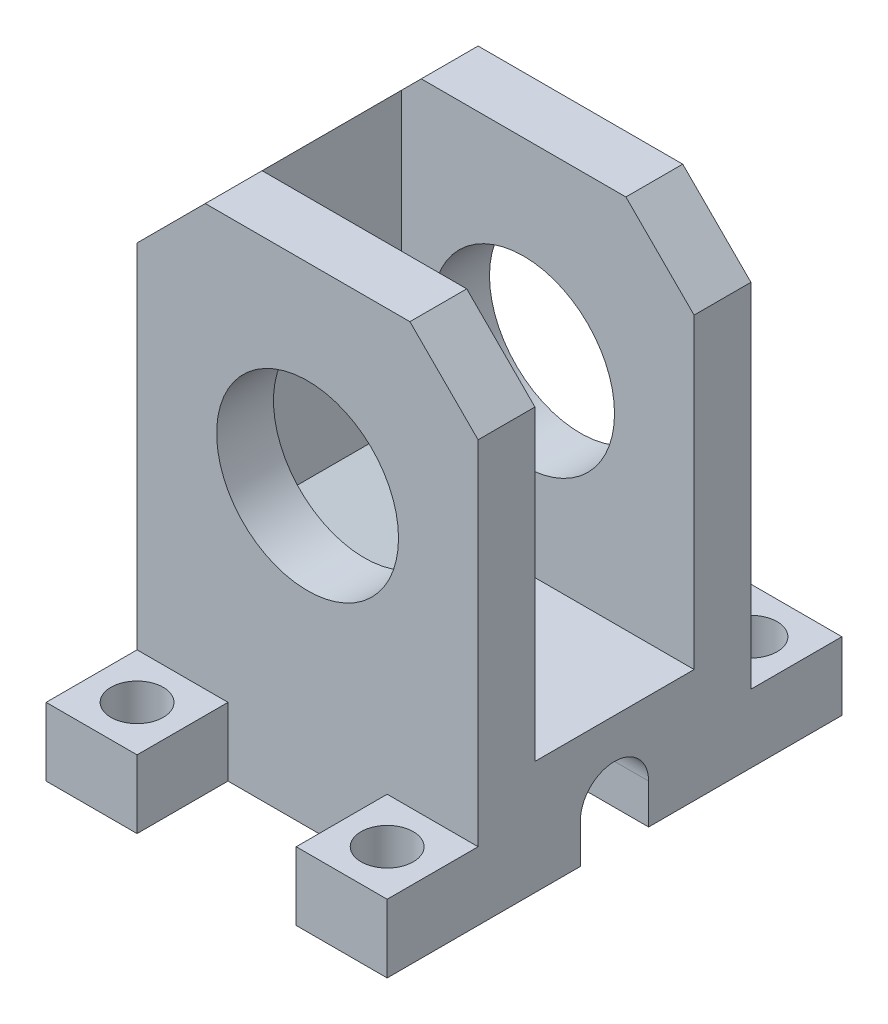
ISO-10303-21;
HEADER;
FILE_DESCRIPTION(('STEP AP214'),'2;1');
FILE_NAME('part.step','',(''),(''),'','','');
FILE_SCHEMA(('AUTOMOTIVE_DESIGN { 1 0 10303 214 1 1 1 1 }'));
ENDSEC;
DATA;
#1=APPLICATION_CONTEXT('core data for automotive mechanical design processes');
#2=APPLICATION_PROTOCOL_DEFINITION('international standard','automotive_design',2000,#1);
#3=PRODUCT_CONTEXT('',#1,'mechanical');
#4=PRODUCT('Part','Part','',(#3));
#5=PRODUCT_RELATED_PRODUCT_CATEGORY('part','',(#4));
#6=PRODUCT_DEFINITION_FORMATION('','',#4);
#7=PRODUCT_DEFINITION_CONTEXT('part definition',#1,'design');
#8=PRODUCT_DEFINITION('design','',#6,#7);
#9=PRODUCT_DEFINITION_SHAPE('','',#8);
#10=(LENGTH_UNIT() NAMED_UNIT(*) SI_UNIT(.MILLI.,.METRE.));
#11=(NAMED_UNIT(*) PLANE_ANGLE_UNIT() SI_UNIT($,.RADIAN.));
#12=(NAMED_UNIT(*) SI_UNIT($,.STERADIAN.) SOLID_ANGLE_UNIT());
#13=UNCERTAINTY_MEASURE_WITH_UNIT(LENGTH_MEASURE(1.E-05),#10,'distance_accuracy_value','');
#14=(GEOMETRIC_REPRESENTATION_CONTEXT(3) GLOBAL_UNCERTAINTY_ASSIGNED_CONTEXT((#13)) GLOBAL_UNIT_ASSIGNED_CONTEXT((#10,
#11,#12)) REPRESENTATION_CONTEXT('',''));
#15=CARTESIAN_POINT('',(0.,0.,0.));
#16=DIRECTION('',(0.,0.,1.));
#17=DIRECTION('',(1.,0.,0.));
#18=AXIS2_PLACEMENT_3D('',#15,#16,#17);
#19=CARTESIAN_POINT('',(0.,0.,-5.));
#20=DIRECTION('',(0.,0.,-1.));
#21=DIRECTION('',(-1.,0.,0.));
#22=AXIS2_PLACEMENT_3D('',#19,#20,#21);
#23=PLANE('',#22);
#24=CARTESIAN_POINT('',(0.,28.,-5.));
#25=DIRECTION('',(0.,0.,1.));
#26=DIRECTION('',(1.,0.,0.));
#27=AXIS2_PLACEMENT_3D('',#24,#25,#26);
#28=CIRCLE('',#27,8.);
#29=CARTESIAN_POINT('',(8.,28.,-5.));
#30=VERTEX_POINT('',#29);
#31=EDGE_CURVE('E257',#30,#30,#28,.T.);
#32=ORIENTED_EDGE('',*,*,#31,.T.);
#33=EDGE_LOOP('',(#32));
#34=FACE_BOUND('',#33,.T.);
#35=DIRECTION('',(0.882352941176471,-0.470588235294118,0.));
#36=VECTOR('',#35,1.);
#37=CARTESIAN_POINT('',(-15.,20.,-5.));
#38=LINE('',#37,#36);
#39=CARTESIAN_POINT('',(-10.7573593128807,17.737258300203,-5.));
#40=VERTEX_POINT('',#39);
#41=CARTESIAN_POINT('',(0.,12.,-5.));
#42=VERTEX_POINT('',#41);
#43=EDGE_CURVE('E848',#40,#42,#38,.T.);
#44=ORIENTED_EDGE('',*,*,#43,.F.);
#45=DIRECTION('',(0.,1.,0.));
#46=VECTOR('',#45,1.);
#47=CARTESIAN_POINT('',(-10.7573593128807,0.,-5.));
#48=LINE('',#47,#46);
#49=CARTESIAN_POINT('',(-10.7573593128807,43.2426406871193,-5.));
#50=VERTEX_POINT('',#49);
#51=EDGE_CURVE('E59',#40,#50,#48,.T.);
#52=ORIENTED_EDGE('',*,*,#51,.T.);
#53=DIRECTION('',(0.707106781186548,0.707106781186547,0.));
#54=VECTOR('',#53,1.);
#55=CARTESIAN_POINT('',(-27.,27.,-5.));
#56=LINE('',#55,#54);
#57=CARTESIAN_POINT('',(-9.,45.,-5.));
#58=VERTEX_POINT('',#57);
#59=EDGE_CURVE('E331',#50,#58,#56,.T.);
#60=ORIENTED_EDGE('',*,*,#59,.T.);
#61=DIRECTION('',(-1.,0.,0.));
#62=VECTOR('',#61,1.);
#63=CARTESIAN_POINT('',(-15.,45.,-5.));
#64=LINE('',#63,#62);
#65=CARTESIAN_POINT('',(8.99999999999999,45.,-5.));
#66=VERTEX_POINT('',#65);
#67=EDGE_CURVE('E246',#66,#58,#64,.T.);
#68=ORIENTED_EDGE('',*,*,#67,.F.);
#69=DIRECTION('',(0.707106781186548,-0.707106781186547,0.));
#70=VECTOR('',#69,1.);
#71=CARTESIAN_POINT('',(27.,27.,-5.));
#72=LINE('',#71,#70);
#73=CARTESIAN_POINT('',(15.,39.,-5.));
#74=VERTEX_POINT('',#73);
#75=EDGE_CURVE('E321',#66,#74,#72,.T.);
#76=ORIENTED_EDGE('',*,*,#75,.T.);
#77=DIRECTION('',(0.,1.,0.));
#78=VECTOR('',#77,1.);
#79=CARTESIAN_POINT('',(15.,45.,-5.));
#80=LINE('',#79,#78);
#81=CARTESIAN_POINT('',(15.,12.,-5.));
#82=VERTEX_POINT('',#81);
#83=EDGE_CURVE('E255',#82,#74,#80,.T.);
#84=ORIENTED_EDGE('',*,*,#83,.F.);
#85=DIRECTION('',(1.,0.,0.));
#86=VECTOR('',#85,1.);
#87=CARTESIAN_POINT('',(-15.,12.,-5.));
#88=LINE('',#87,#86);
#89=EDGE_CURVE('E298',#42,#82,#88,.T.);
#90=ORIENTED_EDGE('',*,*,#89,.F.);
#91=EDGE_LOOP('',(#44,#52,#60,#68,#76,#84,#90));
#92=FACE_BOUND('',#91,.T.);
#93=ADVANCED_FACE('F36',(#34,#92),#23,.T.);
#94=CARTESIAN_POINT('',(-15.,45.,-19.));
#95=DIRECTION('',(0.,0.,1.));
#96=DIRECTION('',(1.,0.,0.));
#97=AXIS2_PLACEMENT_3D('',#94,#95,#96);
#98=PLANE('',#97);
#99=CARTESIAN_POINT('',(0.,28.,-19.));
#100=DIRECTION('',(0.,0.,1.));
#101=DIRECTION('',(1.,0.,0.));
#102=AXIS2_PLACEMENT_3D('',#99,#100,#101);
#103=CIRCLE('',#102,8.);
#104=CARTESIAN_POINT('',(8.00000000000001,28.,-19.));
#105=VERTEX_POINT('',#104);
#106=EDGE_CURVE('E291',#105,#105,#103,.T.);
#107=ORIENTED_EDGE('',*,*,#106,.F.);
#108=EDGE_LOOP('',(#107));
#109=FACE_BOUND('',#108,.T.);
#110=DIRECTION('',(-0.707106781186548,-0.707106781186547,0.));
#111=VECTOR('',#110,1.);
#112=CARTESIAN_POINT('',(-12.,42.,-19.));
#113=LINE('',#112,#111);
#114=CARTESIAN_POINT('',(-9.00000000000001,45.,-19.));
#115=VERTEX_POINT('',#114);
#116=CARTESIAN_POINT('',(-10.7573593128807,43.2426406871193,-19.));
#117=VERTEX_POINT('',#116);
#118=EDGE_CURVE('E51',#115,#117,#113,.T.);
#119=ORIENTED_EDGE('',*,*,#118,.T.);
#120=DIRECTION('',(0.,1.,0.));
#121=VECTOR('',#120,1.);
#122=CARTESIAN_POINT('',(-10.7573593128807,43.2426406871193,-19.));
#123=LINE('',#122,#121);
#124=CARTESIAN_POINT('',(-10.7573593128807,17.737258300203,-19.));
#125=VERTEX_POINT('',#124);
#126=EDGE_CURVE('E852',#125,#117,#123,.T.);
#127=ORIENTED_EDGE('',*,*,#126,.F.);
#128=DIRECTION('',(0.882352941176471,-0.470588235294118,0.));
#129=VECTOR('',#128,1.);
#130=CARTESIAN_POINT('',(-15.,20.,-19.));
#131=LINE('',#130,#129);
#132=CARTESIAN_POINT('',(0.,12.,-19.));
#133=VERTEX_POINT('',#132);
#134=EDGE_CURVE('E850',#125,#133,#131,.T.);
#135=ORIENTED_EDGE('',*,*,#134,.T.);
#136=DIRECTION('',(1.,0.,0.));
#137=VECTOR('',#136,1.);
#138=CARTESIAN_POINT('',(-15.,12.,-19.));
#139=LINE('',#138,#137);
#140=CARTESIAN_POINT('',(15.,12.,-19.));
#141=VERTEX_POINT('',#140);
#142=EDGE_CURVE('E300',#133,#141,#139,.T.);
#143=ORIENTED_EDGE('',*,*,#142,.T.);
#144=DIRECTION('',(0.,-1.,0.));
#145=VECTOR('',#144,1.);
#146=CARTESIAN_POINT('',(15.,45.,-19.));
#147=LINE('',#146,#145);
#148=CARTESIAN_POINT('',(15.,39.,-19.));
#149=VERTEX_POINT('',#148);
#150=EDGE_CURVE('E295',#149,#141,#147,.T.);
#151=ORIENTED_EDGE('',*,*,#150,.F.);
#152=DIRECTION('',(-0.707106781186548,0.707106781186547,0.));
#153=VECTOR('',#152,1.);
#154=CARTESIAN_POINT('',(-3.00000000000001,57.,-19.));
#155=LINE('',#154,#153);
#156=CARTESIAN_POINT('',(8.99999999999999,45.,-19.));
#157=VERTEX_POINT('',#156);
#158=EDGE_CURVE('E286',#149,#157,#155,.T.);
#159=ORIENTED_EDGE('',*,*,#158,.T.);
#160=DIRECTION('',(-1.,0.,0.));
#161=VECTOR('',#160,1.);
#162=CARTESIAN_POINT('',(-15.,45.,-19.));
#163=LINE('',#162,#161);
#164=EDGE_CURVE('E279',#157,#115,#163,.T.);
#165=ORIENTED_EDGE('',*,*,#164,.T.);
#166=EDGE_LOOP('',(#119,#127,#135,#143,#151,#159,#165));
#167=FACE_BOUND('',#166,.T.);
#168=ADVANCED_FACE('F284',(#109,#167),#98,.T.);
#169=CARTESIAN_POINT('',(-15.,20.,-19.));
#170=DIRECTION('',(-0.470588235294118,-0.88235294117647,0.));
#171=DIRECTION('',(0.882352941176471,-0.470588235294118,0.));
#172=AXIS2_PLACEMENT_3D('',#169,#170,#171);
#173=PLANE('',#172);
#174=DIRECTION('',(0.,0.,-1.));
#175=VECTOR('',#174,1.);
#176=CARTESIAN_POINT('',(-10.7573593128807,17.737258300203,-19.));
#177=LINE('',#176,#175);
#178=EDGE_CURVE('E11',#40,#125,#177,.T.);
#179=ORIENTED_EDGE('',*,*,#178,.F.);
#180=ORIENTED_EDGE('',*,*,#43,.T.);
#181=DIRECTION('',(0.,0.,1.));
#182=VECTOR('',#181,1.);
#183=CARTESIAN_POINT('',(0.,12.,-19.));
#184=LINE('',#183,#182);
#185=EDGE_CURVE('E856',#133,#42,#184,.T.);
#186=ORIENTED_EDGE('',*,*,#185,.F.);
#187=ORIENTED_EDGE('',*,*,#134,.F.);
#188=EDGE_LOOP('',(#179,#180,#186,#187));
#189=FACE_BOUND('',#188,.T.);
#190=ADVANCED_FACE('F490',(#189),#173,.F.);
#191=CARTESIAN_POINT('',(-15.,12.,-19.));
#192=DIRECTION('',(0.,-1.,0.));
#193=DIRECTION('',(1.,0.,0.));
#194=AXIS2_PLACEMENT_3D('',#191,#192,#193);
#195=PLANE('',#194);
#196=ORIENTED_EDGE('',*,*,#185,.T.);
#197=ORIENTED_EDGE('',*,*,#89,.T.);
#198=DIRECTION('',(0.,0.,1.));
#199=VECTOR('',#198,1.);
#200=CARTESIAN_POINT('',(15.,12.,-19.));
#201=LINE('',#200,#199);
#202=EDGE_CURVE('E302',#141,#82,#201,.T.);
#203=ORIENTED_EDGE('',*,*,#202,.F.);
#204=ORIENTED_EDGE('',*,*,#142,.F.);
#205=EDGE_LOOP('',(#196,#197,#203,#204));
#206=FACE_BOUND('',#205,.T.);
#207=ADVANCED_FACE('F496',(#206),#195,.F.);
#208=CARTESIAN_POINT('',(-15.,0.,-5.));
#209=DIRECTION('',(-1.,0.,0.));
#210=DIRECTION('',(0.,0.,1.));
#211=AXIS2_PLACEMENT_3D('',#208,#209,#210);
#212=PLANE('',#211);
#213=DIRECTION('',(0.,0.,1.));
#214=VECTOR('',#213,1.);
#215=CARTESIAN_POINT('',(-15.,39.,-50.));
#216=LINE('',#215,#214);
#217=CARTESIAN_POINT('',(-15.,39.,-24.));
#218=VERTEX_POINT('',#217);
#219=CARTESIAN_POINT('',(-15.,39.,0.));
#220=VERTEX_POINT('',#219);
#221=EDGE_CURVE('E234',#218,#220,#216,.T.);
#222=ORIENTED_EDGE('',*,*,#221,.F.);
#223=DIRECTION('',(0.,-1.,0.));
#224=VECTOR('',#223,1.);
#225=CARTESIAN_POINT('',(-15.,45.,-24.));
#226=LINE('',#225,#224);
#227=CARTESIAN_POINT('',(-15.,8.00000000000001,-24.));
#228=VERTEX_POINT('',#227);
#229=EDGE_CURVE('E287',#218,#228,#226,.T.);
#230=ORIENTED_EDGE('',*,*,#229,.T.);
#231=DIRECTION('',(0.,0.,-1.));
#232=VECTOR('',#231,1.);
#233=CARTESIAN_POINT('',(-15.,8.,-24.));
#234=LINE('',#233,#232);
#235=CARTESIAN_POINT('',(-15.,8.,-32.));
#236=VERTEX_POINT('',#235);
#237=EDGE_CURVE('E416',#228,#236,#234,.T.);
#238=ORIENTED_EDGE('',*,*,#237,.T.);
#239=DIRECTION('',(0.,-1.,0.));
#240=VECTOR('',#239,1.);
#241=CARTESIAN_POINT('',(-15.,8.,-32.));
#242=LINE('',#241,#240);
#243=CARTESIAN_POINT('',(-15.,2.,-32.));
#244=VERTEX_POINT('',#243);
#245=EDGE_CURVE('E425',#236,#244,#242,.T.);
#246=ORIENTED_EDGE('',*,*,#245,.T.);
#247=DIRECTION('',(0.,0.,-1.));
#248=VECTOR('',#247,1.);
#249=CARTESIAN_POINT('',(-15.,2.,8.));
#250=LINE('',#249,#248);
#251=CARTESIAN_POINT('',(-15.,2.,-15.));
#252=VERTEX_POINT('',#251);
#253=EDGE_CURVE('E353',#252,#244,#250,.T.);
#254=ORIENTED_EDGE('',*,*,#253,.F.);
#255=DIRECTION('',(0.,-1.,0.));
#256=VECTOR('',#255,1.);
#257=CARTESIAN_POINT('',(-15.,0.,-15.));
#258=LINE('',#257,#256);
#259=CARTESIAN_POINT('',(-15.,5.5,-15.));
#260=VERTEX_POINT('',#259);
#261=EDGE_CURVE('E338',#260,#252,#258,.T.);
#262=ORIENTED_EDGE('',*,*,#261,.F.);
#263=CARTESIAN_POINT('',(-15.,5.5,-12.));
#264=DIRECTION('',(-1.,0.,0.));
#265=DIRECTION('',(0.,0.,1.));
#266=AXIS2_PLACEMENT_3D('',#263,#264,#265);
#267=CIRCLE('',#266,3.);
#268=CARTESIAN_POINT('',(-15.,5.5,-9.00000000000001));
#269=VERTEX_POINT('',#268);
#270=EDGE_CURVE('E335',#269,#260,#267,.T.);
#271=ORIENTED_EDGE('',*,*,#270,.F.);
#272=DIRECTION('',(0.,1.,0.));
#273=VECTOR('',#272,1.);
#274=CARTESIAN_POINT('',(-15.,0.,-9.00000000000001));
#275=LINE('',#274,#273);
#276=CARTESIAN_POINT('',(-15.,2.,-9.00000000000001));
#277=VERTEX_POINT('',#276);
#278=EDGE_CURVE('E340',#277,#269,#275,.T.);
#279=ORIENTED_EDGE('',*,*,#278,.F.);
#280=CARTESIAN_POINT('',(-15.,2.,8.));
#281=VERTEX_POINT('',#280);
#282=EDGE_CURVE('E354',#281,#277,#250,.T.);
#283=ORIENTED_EDGE('',*,*,#282,.F.);
#284=DIRECTION('',(0.,-1.,0.));
#285=VECTOR('',#284,1.);
#286=CARTESIAN_POINT('',(-15.,8.,8.));
#287=LINE('',#286,#285);
#288=CARTESIAN_POINT('',(-15.,8.,8.));
#289=VERTEX_POINT('',#288);
#290=EDGE_CURVE('E473',#289,#281,#287,.T.);
#291=ORIENTED_EDGE('',*,*,#290,.F.);
#292=DIRECTION('',(0.,0.,-1.));
#293=VECTOR('',#292,1.);
#294=CARTESIAN_POINT('',(-15.,8.,0.));
#295=LINE('',#294,#293);
#296=CARTESIAN_POINT('',(-15.,8.,0.));
#297=VERTEX_POINT('',#296);
#298=EDGE_CURVE('E469',#289,#297,#295,.T.);
#299=ORIENTED_EDGE('',*,*,#298,.T.);
#300=DIRECTION('',(0.,-1.,0.));
#301=VECTOR('',#300,1.);
#302=CARTESIAN_POINT('',(-15.,0.,0.));
#303=LINE('',#302,#301);
#304=EDGE_CURVE('E252',#220,#297,#303,.T.);
#305=ORIENTED_EDGE('',*,*,#304,.F.);
#306=EDGE_LOOP('',(#222,#230,#238,#246,#254,#262,#271,#279,#283,#291,#299,#305));
#307=FACE_BOUND('',#306,.T.);
#308=ADVANCED_FACE('F510',(#307),#212,.T.);
#309=CARTESIAN_POINT('',(15.,45.,-5.));
#310=DIRECTION('',(1.,0.,0.));
#311=DIRECTION('',(0.,1.,0.));
#312=AXIS2_PLACEMENT_3D('',#309,#310,#311);
#313=PLANE('',#312);
#314=DIRECTION('',(0.,-1.,0.));
#315=VECTOR('',#314,1.);
#316=CARTESIAN_POINT('',(15.,45.,-24.));
#317=LINE('',#316,#315);
#318=CARTESIAN_POINT('',(15.,39.,-24.));
#319=VERTEX_POINT('',#318);
#320=CARTESIAN_POINT('',(15.,8.,-24.));
#321=VERTEX_POINT('',#320);
#322=EDGE_CURVE('E289',#319,#321,#317,.T.);
#323=ORIENTED_EDGE('',*,*,#322,.F.);
#324=DIRECTION('',(0.,0.,1.));
#325=VECTOR('',#324,1.);
#326=CARTESIAN_POINT('',(15.,39.,-50.));
#327=LINE('',#326,#325);
#328=EDGE_CURVE('E862',#319,#149,#327,.T.);
#329=ORIENTED_EDGE('',*,*,#328,.T.);
#330=ORIENTED_EDGE('',*,*,#150,.T.);
#331=ORIENTED_EDGE('',*,*,#202,.T.);
#332=ORIENTED_EDGE('',*,*,#83,.T.);
#333=CARTESIAN_POINT('',(15.,39.,0.));
#334=VERTEX_POINT('',#333);
#335=EDGE_CURVE('E317',#74,#334,#327,.T.);
#336=ORIENTED_EDGE('',*,*,#335,.T.);
#337=DIRECTION('',(0.,1.,0.));
#338=VECTOR('',#337,1.);
#339=CARTESIAN_POINT('',(15.,45.,0.));
#340=LINE('',#339,#338);
#341=CARTESIAN_POINT('',(15.,8.00000000000001,0.));
#342=VERTEX_POINT('',#341);
#343=EDGE_CURVE('E253',#342,#334,#340,.T.);
#344=ORIENTED_EDGE('',*,*,#343,.F.);
#345=DIRECTION('',(0.,0.,1.));
#346=VECTOR('',#345,1.);
#347=CARTESIAN_POINT('',(15.,8.,0.));
#348=LINE('',#347,#346);
#349=CARTESIAN_POINT('',(15.,8.,8.));
#350=VERTEX_POINT('',#349);
#351=EDGE_CURVE('E439',#342,#350,#348,.T.);
#352=ORIENTED_EDGE('',*,*,#351,.T.);
#353=DIRECTION('',(0.,-1.,0.));
#354=VECTOR('',#353,1.);
#355=CARTESIAN_POINT('',(15.,8.,8.));
#356=LINE('',#355,#354);
#357=CARTESIAN_POINT('',(15.,2.,8.));
#358=VERTEX_POINT('',#357);
#359=EDGE_CURVE('E448',#350,#358,#356,.T.);
#360=ORIENTED_EDGE('',*,*,#359,.T.);
#361=DIRECTION('',(0.,0.,1.));
#362=VECTOR('',#361,1.);
#363=CARTESIAN_POINT('',(15.,2.,-32.));
#364=LINE('',#363,#362);
#365=CARTESIAN_POINT('',(15.,2.,-9.00000000000001));
#366=VERTEX_POINT('',#365);
#367=EDGE_CURVE('E367',#366,#358,#364,.T.);
#368=ORIENTED_EDGE('',*,*,#367,.F.);
#369=DIRECTION('',(0.,-1.,0.));
#370=VECTOR('',#369,1.);
#371=CARTESIAN_POINT('',(15.,45.,-9.00000000000001));
#372=LINE('',#371,#370);
#373=CARTESIAN_POINT('',(15.,5.5,-9.00000000000001));
#374=VERTEX_POINT('',#373);
#375=EDGE_CURVE('E349',#374,#366,#372,.T.);
#376=ORIENTED_EDGE('',*,*,#375,.F.);
#377=CARTESIAN_POINT('',(15.,5.5,-12.));
#378=DIRECTION('',(1.,0.,0.));
#379=DIRECTION('',(0.,1.,0.));
#380=AXIS2_PLACEMENT_3D('',#377,#378,#379);
#381=CIRCLE('',#380,3.);
#382=CARTESIAN_POINT('',(15.,5.5,-15.));
#383=VERTEX_POINT('',#382);
#384=EDGE_CURVE('E270',#383,#374,#381,.T.);
#385=ORIENTED_EDGE('',*,*,#384,.F.);
#386=DIRECTION('',(0.,1.,0.));
#387=VECTOR('',#386,1.);
#388=CARTESIAN_POINT('',(15.,45.,-15.));
#389=LINE('',#388,#387);
#390=CARTESIAN_POINT('',(15.,2.,-15.));
#391=VERTEX_POINT('',#390);
#392=EDGE_CURVE('E346',#391,#383,#389,.T.);
#393=ORIENTED_EDGE('',*,*,#392,.F.);
#394=CARTESIAN_POINT('',(15.,2.,-32.));
#395=VERTEX_POINT('',#394);
#396=EDGE_CURVE('E368',#395,#391,#364,.T.);
#397=ORIENTED_EDGE('',*,*,#396,.F.);
#398=DIRECTION('',(0.,-1.,0.));
#399=VECTOR('',#398,1.);
#400=CARTESIAN_POINT('',(15.,8.,-32.));
#401=LINE('',#400,#399);
#402=CARTESIAN_POINT('',(15.,8.,-32.));
#403=VERTEX_POINT('',#402);
#404=EDGE_CURVE('E402',#403,#395,#401,.T.);
#405=ORIENTED_EDGE('',*,*,#404,.F.);
#406=DIRECTION('',(0.,0.,1.));
#407=VECTOR('',#406,1.);
#408=CARTESIAN_POINT('',(15.,8.,-24.));
#409=LINE('',#408,#407);
#410=EDGE_CURVE('E398',#403,#321,#409,.T.);
#411=ORIENTED_EDGE('',*,*,#410,.T.);
#412=EDGE_LOOP('',(#323,#329,#330,#331,#332,#336,#344,#352,#360,#368,#376,#385,#393,#397,#405,#411));
#413=FACE_BOUND('',#412,.T.);
#414=ADVANCED_FACE('F38',(#413),#313,.T.);
#415=CARTESIAN_POINT('',(0.,0.,0.));
#416=DIRECTION('',(0.,0.,-1.));
#417=DIRECTION('',(-1.,0.,0.));
#418=AXIS2_PLACEMENT_3D('',#415,#416,#417);
#419=PLANE('',#418);
#420=CARTESIAN_POINT('',(0.,28.,0.));
#421=DIRECTION('',(0.,0.,1.));
#422=DIRECTION('',(1.,0.,0.));
#423=AXIS2_PLACEMENT_3D('',#420,#421,#422);
#424=CIRCLE('',#423,8.);
#425=CARTESIAN_POINT('',(8.,28.,0.));
#426=VERTEX_POINT('',#425);
#427=EDGE_CURVE('E306',#426,#426,#424,.T.);
#428=ORIENTED_EDGE('',*,*,#427,.F.);
#429=EDGE_LOOP('',(#428));
#430=FACE_BOUND('',#429,.T.);
#431=DIRECTION('',(-0.707106781186548,-0.707106781186547,0.));
#432=VECTOR('',#431,1.);
#433=CARTESIAN_POINT('',(-27.,27.,0.));
#434=LINE('',#433,#432);
#435=CARTESIAN_POINT('',(-9.,45.,0.));
#436=VERTEX_POINT('',#435);
#437=EDGE_CURVE('E228',#436,#220,#434,.T.);
#438=ORIENTED_EDGE('',*,*,#437,.T.);
#439=ORIENTED_EDGE('',*,*,#304,.T.);
#440=DIRECTION('',(1.,0.,0.));
#441=VECTOR('',#440,1.);
#442=CARTESIAN_POINT('',(-15.,8.,0.));
#443=LINE('',#442,#441);
#444=CARTESIAN_POINT('',(-7.,8.,0.));
#445=VERTEX_POINT('',#444);
#446=EDGE_CURVE('E460',#297,#445,#443,.T.);
#447=ORIENTED_EDGE('',*,*,#446,.T.);
#448=DIRECTION('',(0.,-1.,0.));
#449=VECTOR('',#448,1.);
#450=CARTESIAN_POINT('',(-7.,8.,0.));
#451=LINE('',#450,#449);
#452=CARTESIAN_POINT('',(-7.,2.,0.));
#453=VERTEX_POINT('',#452);
#454=EDGE_CURVE('E472',#445,#453,#451,.T.);
#455=ORIENTED_EDGE('',*,*,#454,.T.);
#456=DIRECTION('',(-1.,0.,0.));
#457=VECTOR('',#456,1.);
#458=CARTESIAN_POINT('',(7.,2.,0.));
#459=LINE('',#458,#457);
#460=CARTESIAN_POINT('',(7.,2.,0.));
#461=VERTEX_POINT('',#460);
#462=EDGE_CURVE('E375',#461,#453,#459,.T.);
#463=ORIENTED_EDGE('',*,*,#462,.F.);
#464=DIRECTION('',(0.,-1.,0.));
#465=VECTOR('',#464,1.);
#466=CARTESIAN_POINT('',(7.,8.,0.));
#467=LINE('',#466,#465);
#468=CARTESIAN_POINT('',(7.,8.,0.));
#469=VERTEX_POINT('',#468);
#470=EDGE_CURVE('E449',#469,#461,#467,.T.);
#471=ORIENTED_EDGE('',*,*,#470,.F.);
#472=DIRECTION('',(1.,0.,0.));
#473=VECTOR('',#472,1.);
#474=CARTESIAN_POINT('',(7.,8.,0.));
#475=LINE('',#474,#473);
#476=EDGE_CURVE('E437',#469,#342,#475,.T.);
#477=ORIENTED_EDGE('',*,*,#476,.T.);
#478=ORIENTED_EDGE('',*,*,#343,.T.);
#479=DIRECTION('',(-0.707106781186548,0.707106781186547,0.));
#480=VECTOR('',#479,1.);
#481=CARTESIAN_POINT('',(27.,27.,0.));
#482=LINE('',#481,#480);
#483=CARTESIAN_POINT('',(8.99999999999999,45.,0.));
#484=VERTEX_POINT('',#483);
#485=EDGE_CURVE('E251',#334,#484,#482,.T.);
#486=ORIENTED_EDGE('',*,*,#485,.T.);
#487=DIRECTION('',(-1.,0.,0.));
#488=VECTOR('',#487,1.);
#489=CARTESIAN_POINT('',(-15.,45.,0.));
#490=LINE('',#489,#488);
#491=EDGE_CURVE('E244',#484,#436,#490,.T.);
#492=ORIENTED_EDGE('',*,*,#491,.T.);
#493=EDGE_LOOP('',(#438,#439,#447,#455,#463,#471,#477,#478,#486,#492));
#494=FACE_BOUND('',#493,.T.);
#495=ADVANCED_FACE('F249',(#430,#494),#419,.F.);
#496=CARTESIAN_POINT('',(15.,45.,-24.));
#497=DIRECTION('',(0.,0.,-1.));
#498=DIRECTION('',(-1.,0.,0.));
#499=AXIS2_PLACEMENT_3D('',#496,#497,#498);
#500=PLANE('',#499);
#501=CARTESIAN_POINT('',(0.,28.,-24.));
#502=DIRECTION('',(0.,0.,-1.));
#503=DIRECTION('',(-1.,0.,0.));
#504=AXIS2_PLACEMENT_3D('',#501,#502,#503);
#505=CIRCLE('',#504,8.);
#506=CARTESIAN_POINT('',(-7.99999999999999,28.,-24.));
#507=VERTEX_POINT('',#506);
#508=EDGE_CURVE('E476',#507,#507,#505,.T.);
#509=ORIENTED_EDGE('',*,*,#508,.F.);
#510=EDGE_LOOP('',(#509));
#511=FACE_BOUND('',#510,.T.);
#512=ORIENTED_EDGE('',*,*,#229,.F.);
#513=DIRECTION('',(0.707106781186548,0.707106781186547,0.));
#514=VECTOR('',#513,1.);
#515=CARTESIAN_POINT('',(3.,57.,-24.));
#516=LINE('',#515,#514);
#517=CARTESIAN_POINT('',(-9.,45.,-24.));
#518=VERTEX_POINT('',#517);
#519=EDGE_CURVE('E333',#218,#518,#516,.T.);
#520=ORIENTED_EDGE('',*,*,#519,.T.);
#521=DIRECTION('',(1.,0.,0.));
#522=VECTOR('',#521,1.);
#523=CARTESIAN_POINT('',(15.,45.,-24.));
#524=LINE('',#523,#522);
#525=CARTESIAN_POINT('',(8.99999999999999,45.,-24.));
#526=VERTEX_POINT('',#525);
#527=EDGE_CURVE('E281',#518,#526,#524,.T.);
#528=ORIENTED_EDGE('',*,*,#527,.T.);
#529=DIRECTION('',(0.707106781186548,-0.707106781186547,0.));
#530=VECTOR('',#529,1.);
#531=CARTESIAN_POINT('',(12.,42.,-24.));
#532=LINE('',#531,#530);
#533=EDGE_CURVE('E323',#526,#319,#532,.T.);
#534=ORIENTED_EDGE('',*,*,#533,.T.);
#535=ORIENTED_EDGE('',*,*,#322,.T.);
#536=DIRECTION('',(-1.,0.,0.));
#537=VECTOR('',#536,1.);
#538=CARTESIAN_POINT('',(7.,8.,-24.));
#539=LINE('',#538,#537);
#540=CARTESIAN_POINT('',(7.,8.,-24.));
#541=VERTEX_POINT('',#540);
#542=EDGE_CURVE('E389',#321,#541,#539,.T.);
#543=ORIENTED_EDGE('',*,*,#542,.T.);
#544=DIRECTION('',(0.,-1.,0.));
#545=VECTOR('',#544,1.);
#546=CARTESIAN_POINT('',(7.,8.,-24.));
#547=LINE('',#546,#545);
#548=CARTESIAN_POINT('',(7.,2.,-24.));
#549=VERTEX_POINT('',#548);
#550=EDGE_CURVE('E401',#541,#549,#547,.T.);
#551=ORIENTED_EDGE('',*,*,#550,.T.);
#552=DIRECTION('',(1.,0.,0.));
#553=VECTOR('',#552,1.);
#554=CARTESIAN_POINT('',(-7.,2.,-24.));
#555=LINE('',#554,#553);
#556=CARTESIAN_POINT('',(-7.,2.,-24.));
#557=VERTEX_POINT('',#556);
#558=EDGE_CURVE('E361',#557,#549,#555,.T.);
#559=ORIENTED_EDGE('',*,*,#558,.F.);
#560=DIRECTION('',(0.,-1.,0.));
#561=VECTOR('',#560,1.);
#562=CARTESIAN_POINT('',(-7.,8.,-24.));
#563=LINE('',#562,#561);
#564=CARTESIAN_POINT('',(-7.,8.,-24.));
#565=VERTEX_POINT('',#564);
#566=EDGE_CURVE('E426',#565,#557,#563,.T.);
#567=ORIENTED_EDGE('',*,*,#566,.F.);
#568=DIRECTION('',(-1.,0.,0.));
#569=VECTOR('',#568,1.);
#570=CARTESIAN_POINT('',(-7.,8.,-24.));
#571=LINE('',#570,#569);
#572=EDGE_CURVE('E413',#565,#228,#571,.T.);
#573=ORIENTED_EDGE('',*,*,#572,.T.);
#574=EDGE_LOOP('',(#512,#520,#528,#534,#535,#543,#551,#559,#567,#573));
#575=FACE_BOUND('',#574,.T.);
#576=ADVANCED_FACE('F504',(#511,#575),#500,.T.);
#577=CARTESIAN_POINT('',(-15.,45.,-5.));
#578=DIRECTION('',(0.,1.,0.));
#579=DIRECTION('',(0.,0.,1.));
#580=AXIS2_PLACEMENT_3D('',#577,#578,#579);
#581=PLANE('',#580);
#582=ORIENTED_EDGE('',*,*,#67,.T.);
#583=DIRECTION('',(0.,0.,1.));
#584=VECTOR('',#583,1.);
#585=CARTESIAN_POINT('',(-9.,45.,-50.));
#586=LINE('',#585,#584);
#587=EDGE_CURVE('E231',#58,#436,#586,.T.);
#588=ORIENTED_EDGE('',*,*,#587,.T.);
#589=ORIENTED_EDGE('',*,*,#491,.F.);
#590=DIRECTION('',(0.,0.,1.));
#591=VECTOR('',#590,1.);
#592=CARTESIAN_POINT('',(8.99999999999999,45.,-50.));
#593=LINE('',#592,#591);
#594=EDGE_CURVE('E238',#66,#484,#593,.T.);
#595=ORIENTED_EDGE('',*,*,#594,.F.);
#596=EDGE_LOOP('',(#582,#588,#589,#595));
#597=FACE_BOUND('',#596,.T.);
#598=ADVANCED_FACE('F242',(#597),#581,.T.);
#599=CARTESIAN_POINT('',(0.,45.,0.));
#600=DIRECTION('',(0.,1.,0.));
#601=DIRECTION('',(0.,0.,1.));
#602=AXIS2_PLACEMENT_3D('',#599,#600,#601);
#603=PLANE('',#602);
#604=ORIENTED_EDGE('',*,*,#527,.F.);
#605=DIRECTION('',(0.,0.,1.));
#606=VECTOR('',#605,1.);
#607=CARTESIAN_POINT('',(-9.00000000000001,45.,0.));
#608=LINE('',#607,#606);
#609=EDGE_CURVE('E44',#518,#115,#608,.T.);
#610=ORIENTED_EDGE('',*,*,#609,.T.);
#611=ORIENTED_EDGE('',*,*,#164,.F.);
#612=DIRECTION('',(0.,0.,-1.));
#613=VECTOR('',#612,1.);
#614=CARTESIAN_POINT('',(8.99999999999999,45.,0.));
#615=LINE('',#614,#613);
#616=EDGE_CURVE('E272',#157,#526,#615,.T.);
#617=ORIENTED_EDGE('',*,*,#616,.T.);
#618=EDGE_LOOP('',(#604,#610,#611,#617));
#619=FACE_BOUND('',#618,.T.);
#620=ADVANCED_FACE('F278',(#619),#603,.T.);
#621=CARTESIAN_POINT('',(0.,2.,0.));
#622=DIRECTION('',(0.,-1.,0.));
#623=DIRECTION('',(0.,0.,-1.));
#624=AXIS2_PLACEMENT_3D('',#621,#622,#623);
#625=PLANE('',#624);
#626=DIRECTION('',(-1.,0.,0.));
#627=VECTOR('',#626,1.);
#628=CARTESIAN_POINT('',(0.,2.,-9.00000000000001));
#629=LINE('',#628,#627);
#630=EDGE_CURVE('E268',#366,#277,#629,.T.);
#631=ORIENTED_EDGE('',*,*,#630,.F.);
#632=ORIENTED_EDGE('',*,*,#367,.T.);
#633=DIRECTION('',(-1.,0.,0.));
#634=VECTOR('',#633,1.);
#635=CARTESIAN_POINT('',(15.,2.,8.));
#636=LINE('',#635,#634);
#637=CARTESIAN_POINT('',(7.,2.,8.));
#638=VERTEX_POINT('',#637);
#639=EDGE_CURVE('E371',#358,#638,#636,.T.);
#640=ORIENTED_EDGE('',*,*,#639,.T.);
#641=DIRECTION('',(0.,0.,-1.));
#642=VECTOR('',#641,1.);
#643=CARTESIAN_POINT('',(7.,2.,8.));
#644=LINE('',#643,#642);
#645=EDGE_CURVE('E373',#638,#461,#644,.T.);
#646=ORIENTED_EDGE('',*,*,#645,.T.);
#647=ORIENTED_EDGE('',*,*,#462,.T.);
#648=DIRECTION('',(0.,0.,1.));
#649=VECTOR('',#648,1.);
#650=CARTESIAN_POINT('',(-7.,2.,0.));
#651=LINE('',#650,#649);
#652=CARTESIAN_POINT('',(-7.,2.,8.));
#653=VERTEX_POINT('',#652);
#654=EDGE_CURVE('E265',#453,#653,#651,.T.);
#655=ORIENTED_EDGE('',*,*,#654,.T.);
#656=DIRECTION('',(-1.,0.,0.));
#657=VECTOR('',#656,1.);
#658=CARTESIAN_POINT('',(-7.,2.,8.));
#659=LINE('',#658,#657);
#660=EDGE_CURVE('E351',#653,#281,#659,.T.);
#661=ORIENTED_EDGE('',*,*,#660,.T.);
#662=ORIENTED_EDGE('',*,*,#282,.T.);
#663=EDGE_LOOP('',(#631,#632,#640,#646,#647,#655,#661,#662));
#664=FACE_BOUND('',#663,.T.);
#665=CARTESIAN_POINT('',(-11.,2.,4.));
#666=DIRECTION('',(0.,-1.,0.));
#667=DIRECTION('',(0.,0.,-1.));
#668=AXIS2_PLACEMENT_3D('',#665,#666,#667);
#669=CIRCLE('',#668,2.3);
#670=CARTESIAN_POINT('',(-11.,2.,1.7));
#671=VERTEX_POINT('',#670);
#672=EDGE_CURVE('E383',#671,#671,#669,.F.);
#673=ORIENTED_EDGE('',*,*,#672,.T.);
#674=EDGE_LOOP('',(#673));
#675=FACE_BOUND('',#674,.T.);
#676=CARTESIAN_POINT('',(11.,2.,4.));
#677=DIRECTION('',(0.,-1.,0.));
#678=DIRECTION('',(0.,0.,-1.));
#679=AXIS2_PLACEMENT_3D('',#676,#677,#678);
#680=CIRCLE('',#679,2.3);
#681=CARTESIAN_POINT('',(11.,2.,1.7));
#682=VERTEX_POINT('',#681);
#683=EDGE_CURVE('E380',#682,#682,#680,.F.);
#684=ORIENTED_EDGE('',*,*,#683,.T.);
#685=EDGE_LOOP('',(#684));
#686=FACE_BOUND('',#685,.T.);
#687=ADVANCED_FACE('F526',(#664,#675,#686),#625,.T.);
#688=CARTESIAN_POINT('',(-15.,8.,8.));
#689=DIRECTION('',(0.,0.,1.));
#690=DIRECTION('',(1.,0.,0.));
#691=AXIS2_PLACEMENT_3D('',#688,#689,#690);
#692=PLANE('',#691);
#693=ORIENTED_EDGE('',*,*,#290,.T.);
#694=ORIENTED_EDGE('',*,*,#660,.F.);
#695=DIRECTION('',(0.,-1.,0.));
#696=VECTOR('',#695,1.);
#697=CARTESIAN_POINT('',(-7.,8.,8.));
#698=LINE('',#697,#696);
#699=CARTESIAN_POINT('',(-7.,8.,8.));
#700=VERTEX_POINT('',#699);
#701=EDGE_CURVE('E477',#700,#653,#698,.T.);
#702=ORIENTED_EDGE('',*,*,#701,.F.);
#703=DIRECTION('',(-1.,0.,0.));
#704=VECTOR('',#703,1.);
#705=CARTESIAN_POINT('',(-15.,8.,8.));
#706=LINE('',#705,#704);
#707=EDGE_CURVE('E466',#700,#289,#706,.T.);
#708=ORIENTED_EDGE('',*,*,#707,.T.);
#709=EDGE_LOOP('',(#693,#694,#702,#708));
#710=FACE_BOUND('',#709,.T.);
#711=ADVANCED_FACE('F530',(#710),#692,.T.);
#712=CARTESIAN_POINT('',(-7.,8.,8.));
#713=DIRECTION('',(1.,0.,0.));
#714=DIRECTION('',(0.,0.,-1.));
#715=AXIS2_PLACEMENT_3D('',#712,#713,#714);
#716=PLANE('',#715);
#717=ORIENTED_EDGE('',*,*,#701,.T.);
#718=ORIENTED_EDGE('',*,*,#654,.F.);
#719=ORIENTED_EDGE('',*,*,#454,.F.);
#720=DIRECTION('',(0.,0.,1.));
#721=VECTOR('',#720,1.);
#722=CARTESIAN_POINT('',(-7.,8.,8.));
#723=LINE('',#722,#721);
#724=EDGE_CURVE('E463',#445,#700,#723,.T.);
#725=ORIENTED_EDGE('',*,*,#724,.T.);
#726=EDGE_LOOP('',(#717,#718,#719,#725));
#727=FACE_BOUND('',#726,.T.);
#728=ADVANCED_FACE('F537',(#727),#716,.T.);
#729=CARTESIAN_POINT('',(-11.,8.,4.));
#730=DIRECTION('',(0.,-1.,0.));
#731=DIRECTION('',(0.,0.,-1.));
#732=AXIS2_PLACEMENT_3D('',#729,#730,#731);
#733=CYLINDRICAL_SURFACE('',#732,2.3);
#734=CARTESIAN_POINT('',(-11.,8.,4.));
#735=DIRECTION('',(0.,-1.,0.));
#736=DIRECTION('',(0.,0.,-1.));
#737=AXIS2_PLACEMENT_3D('',#734,#735,#736);
#738=CIRCLE('',#737,2.3);
#739=CARTESIAN_POINT('',(-11.,8.,1.7));
#740=VERTEX_POINT('',#739);
#741=EDGE_CURVE('E452',#740,#740,#738,.T.);
#742=ORIENTED_EDGE('',*,*,#741,.F.);
#743=EDGE_LOOP('',(#742));
#744=FACE_BOUND('',#743,.T.);
#745=ORIENTED_EDGE('',*,*,#672,.F.);
#746=EDGE_LOOP('',(#745));
#747=FACE_BOUND('',#746,.T.);
#748=ADVANCED_FACE('F602',(#744,#747),#733,.F.);
#749=CARTESIAN_POINT('',(7.,8.,8.));
#750=DIRECTION('',(-1.,0.,0.));
#751=DIRECTION('',(0.,0.,1.));
#752=AXIS2_PLACEMENT_3D('',#749,#750,#751);
#753=PLANE('',#752);
#754=ORIENTED_EDGE('',*,*,#470,.T.);
#755=ORIENTED_EDGE('',*,*,#645,.F.);
#756=DIRECTION('',(0.,-1.,0.));
#757=VECTOR('',#756,1.);
#758=CARTESIAN_POINT('',(7.,8.,8.));
#759=LINE('',#758,#757);
#760=CARTESIAN_POINT('',(7.,8.,8.));
#761=VERTEX_POINT('',#760);
#762=EDGE_CURVE('E453',#761,#638,#759,.T.);
#763=ORIENTED_EDGE('',*,*,#762,.F.);
#764=DIRECTION('',(0.,0.,-1.));
#765=VECTOR('',#764,1.);
#766=CARTESIAN_POINT('',(7.,8.,8.));
#767=LINE('',#766,#765);
#768=EDGE_CURVE('E445',#761,#469,#767,.T.);
#769=ORIENTED_EDGE('',*,*,#768,.T.);
#770=EDGE_LOOP('',(#754,#755,#763,#769));
#771=FACE_BOUND('',#770,.T.);
#772=ADVANCED_FACE('F599',(#771),#753,.T.);
#773=CARTESIAN_POINT('',(15.,8.,8.));
#774=DIRECTION('',(0.,0.,1.));
#775=DIRECTION('',(1.,0.,0.));
#776=AXIS2_PLACEMENT_3D('',#773,#774,#775);
#777=PLANE('',#776);
#778=ORIENTED_EDGE('',*,*,#762,.T.);
#779=ORIENTED_EDGE('',*,*,#639,.F.);
#780=ORIENTED_EDGE('',*,*,#359,.F.);
#781=DIRECTION('',(-1.,0.,0.));
#782=VECTOR('',#781,1.);
#783=CARTESIAN_POINT('',(15.,8.,8.));
#784=LINE('',#783,#782);
#785=EDGE_CURVE('E442',#350,#761,#784,.T.);
#786=ORIENTED_EDGE('',*,*,#785,.T.);
#787=EDGE_LOOP('',(#778,#779,#780,#786));
#788=FACE_BOUND('',#787,.T.);
#789=ADVANCED_FACE('F593',(#788),#777,.T.);
#790=CARTESIAN_POINT('',(11.,8.,4.));
#791=DIRECTION('',(0.,-1.,0.));
#792=DIRECTION('',(0.,0.,-1.));
#793=AXIS2_PLACEMENT_3D('',#790,#791,#792);
#794=CYLINDRICAL_SURFACE('',#793,2.3);
#795=CARTESIAN_POINT('',(11.,8.,4.));
#796=DIRECTION('',(0.,-1.,0.));
#797=DIRECTION('',(0.,0.,-1.));
#798=AXIS2_PLACEMENT_3D('',#795,#796,#797);
#799=CIRCLE('',#798,2.3);
#800=CARTESIAN_POINT('',(11.,8.,1.7));
#801=VERTEX_POINT('',#800);
#802=EDGE_CURVE('E429',#801,#801,#799,.T.);
#803=ORIENTED_EDGE('',*,*,#802,.F.);
#804=EDGE_LOOP('',(#803));
#805=FACE_BOUND('',#804,.T.);
#806=ORIENTED_EDGE('',*,*,#683,.F.);
#807=EDGE_LOOP('',(#806));
#808=FACE_BOUND('',#807,.T.);
#809=ADVANCED_FACE('F588',(#805,#808),#794,.F.);
#810=CARTESIAN_POINT('',(-7.00000000000001,8.,-32.));
#811=DIRECTION('',(1.,0.,0.));
#812=DIRECTION('',(0.,0.,-1.));
#813=AXIS2_PLACEMENT_3D('',#810,#811,#812);
#814=PLANE('',#813);
#815=ORIENTED_EDGE('',*,*,#566,.T.);
#816=DIRECTION('',(0.,0.,1.));
#817=VECTOR('',#816,1.);
#818=CARTESIAN_POINT('',(-7.00000000000001,2.,-32.));
#819=LINE('',#818,#817);
#820=CARTESIAN_POINT('',(-7.00000000000001,2.,-32.));
#821=VERTEX_POINT('',#820);
#822=EDGE_CURVE('E359',#821,#557,#819,.T.);
#823=ORIENTED_EDGE('',*,*,#822,.F.);
#824=DIRECTION('',(0.,-1.,0.));
#825=VECTOR('',#824,1.);
#826=CARTESIAN_POINT('',(-7.00000000000001,8.,-32.));
#827=LINE('',#826,#825);
#828=CARTESIAN_POINT('',(-7.00000000000001,8.,-32.));
#829=VERTEX_POINT('',#828);
#830=EDGE_CURVE('E430',#829,#821,#827,.T.);
#831=ORIENTED_EDGE('',*,*,#830,.F.);
#832=DIRECTION('',(0.,0.,1.));
#833=VECTOR('',#832,1.);
#834=CARTESIAN_POINT('',(-7.00000000000001,8.,-32.));
#835=LINE('',#834,#833);
#836=EDGE_CURVE('E422',#829,#565,#835,.T.);
#837=ORIENTED_EDGE('',*,*,#836,.T.);
#838=EDGE_LOOP('',(#815,#823,#831,#837));
#839=FACE_BOUND('',#838,.T.);
#840=ADVANCED_FACE('F577',(#839),#814,.T.);
#841=CARTESIAN_POINT('',(-15.,8.,-32.));
#842=DIRECTION('',(0.,0.,-1.));
#843=DIRECTION('',(-1.,0.,0.));
#844=AXIS2_PLACEMENT_3D('',#841,#842,#843);
#845=PLANE('',#844);
#846=ORIENTED_EDGE('',*,*,#830,.T.);
#847=DIRECTION('',(1.,0.,0.));
#848=VECTOR('',#847,1.);
#849=CARTESIAN_POINT('',(-15.,2.,-32.));
#850=LINE('',#849,#848);
#851=EDGE_CURVE('E357',#244,#821,#850,.T.);
#852=ORIENTED_EDGE('',*,*,#851,.F.);
#853=ORIENTED_EDGE('',*,*,#245,.F.);
#854=DIRECTION('',(1.,0.,0.));
#855=VECTOR('',#854,1.);
#856=CARTESIAN_POINT('',(-15.,8.,-32.));
#857=LINE('',#856,#855);
#858=EDGE_CURVE('E419',#236,#829,#857,.T.);
#859=ORIENTED_EDGE('',*,*,#858,.T.);
#860=EDGE_LOOP('',(#846,#852,#853,#859));
#861=FACE_BOUND('',#860,.T.);
#862=ADVANCED_FACE('F567',(#861),#845,.T.);
#863=CARTESIAN_POINT('',(-11.,8.,-28.));
#864=DIRECTION('',(0.,-1.,0.));
#865=DIRECTION('',(0.,0.,-1.));
#866=AXIS2_PLACEMENT_3D('',#863,#864,#865);
#867=CYLINDRICAL_SURFACE('',#866,2.3);
#868=CARTESIAN_POINT('',(-11.,8.,-28.));
#869=DIRECTION('',(0.,-1.,0.));
#870=DIRECTION('',(0.,0.,-1.));
#871=AXIS2_PLACEMENT_3D('',#868,#869,#870);
#872=CIRCLE('',#871,2.3);
#873=CARTESIAN_POINT('',(-11.,8.,-30.3));
#874=VERTEX_POINT('',#873);
#875=EDGE_CURVE('E405',#874,#874,#872,.T.);
#876=ORIENTED_EDGE('',*,*,#875,.F.);
#877=EDGE_LOOP('',(#876));
#878=FACE_BOUND('',#877,.T.);
#879=CARTESIAN_POINT('',(-11.,2.,-28.));
#880=DIRECTION('',(0.,-1.,0.));
#881=DIRECTION('',(0.,0.,-1.));
#882=AXIS2_PLACEMENT_3D('',#879,#880,#881);
#883=CIRCLE('',#882,2.3);
#884=CARTESIAN_POINT('',(-11.,2.,-30.3));
#885=VERTEX_POINT('',#884);
#886=EDGE_CURVE('E264',#885,#885,#883,.F.);
#887=ORIENTED_EDGE('',*,*,#886,.F.);
#888=EDGE_LOOP('',(#887));
#889=FACE_BOUND('',#888,.T.);
#890=ADVANCED_FACE('F564',(#878,#889),#867,.F.);
#891=CARTESIAN_POINT('',(15.,8.,-32.));
#892=DIRECTION('',(0.,0.,-1.));
#893=DIRECTION('',(-1.,0.,0.));
#894=AXIS2_PLACEMENT_3D('',#891,#892,#893);
#895=PLANE('',#894);
#896=ORIENTED_EDGE('',*,*,#404,.T.);
#897=DIRECTION('',(1.,0.,0.));
#898=VECTOR('',#897,1.);
#899=CARTESIAN_POINT('',(7.,2.,-32.));
#900=LINE('',#899,#898);
#901=CARTESIAN_POINT('',(7.,2.,-32.));
#902=VERTEX_POINT('',#901);
#903=EDGE_CURVE('E365',#902,#395,#900,.T.);
#904=ORIENTED_EDGE('',*,*,#903,.F.);
#905=DIRECTION('',(0.,-1.,0.));
#906=VECTOR('',#905,1.);
#907=CARTESIAN_POINT('',(7.,8.,-32.));
#908=LINE('',#907,#906);
#909=CARTESIAN_POINT('',(7.,8.,-32.));
#910=VERTEX_POINT('',#909);
#911=EDGE_CURVE('E406',#910,#902,#908,.T.);
#912=ORIENTED_EDGE('',*,*,#911,.F.);
#913=DIRECTION('',(1.,0.,0.));
#914=VECTOR('',#913,1.);
#915=CARTESIAN_POINT('',(15.,8.,-32.));
#916=LINE('',#915,#914);
#917=EDGE_CURVE('E395',#910,#403,#916,.T.);
#918=ORIENTED_EDGE('',*,*,#917,.T.);
#919=EDGE_LOOP('',(#896,#904,#912,#918));
#920=FACE_BOUND('',#919,.T.);
#921=ADVANCED_FACE('F566',(#920),#895,.T.);
#922=CARTESIAN_POINT('',(7.,8.,-32.));
#923=DIRECTION('',(-1.,0.,0.));
#924=DIRECTION('',(0.,0.,1.));
#925=AXIS2_PLACEMENT_3D('',#922,#923,#924);
#926=PLANE('',#925);
#927=ORIENTED_EDGE('',*,*,#911,.T.);
#928=DIRECTION('',(0.,0.,-1.));
#929=VECTOR('',#928,1.);
#930=CARTESIAN_POINT('',(7.,2.,-24.));
#931=LINE('',#930,#929);
#932=EDGE_CURVE('E363',#549,#902,#931,.T.);
#933=ORIENTED_EDGE('',*,*,#932,.F.);
#934=ORIENTED_EDGE('',*,*,#550,.F.);
#935=DIRECTION('',(0.,0.,-1.));
#936=VECTOR('',#935,1.);
#937=CARTESIAN_POINT('',(7.,8.,-32.));
#938=LINE('',#937,#936);
#939=EDGE_CURVE('E392',#541,#910,#938,.T.);
#940=ORIENTED_EDGE('',*,*,#939,.T.);
#941=EDGE_LOOP('',(#927,#933,#934,#940));
#942=FACE_BOUND('',#941,.T.);
#943=ADVANCED_FACE('F574',(#942),#926,.T.);
#944=CARTESIAN_POINT('',(11.,8.,-28.));
#945=DIRECTION('',(0.,-1.,0.));
#946=DIRECTION('',(0.,0.,-1.));
#947=AXIS2_PLACEMENT_3D('',#944,#945,#946);
#948=CYLINDRICAL_SURFACE('',#947,2.3);
#949=CARTESIAN_POINT('',(11.,8.,-28.));
#950=DIRECTION('',(0.,-1.,0.));
#951=DIRECTION('',(0.,0.,-1.));
#952=AXIS2_PLACEMENT_3D('',#949,#950,#951);
#953=CIRCLE('',#952,2.3);
#954=CARTESIAN_POINT('',(11.,8.,-30.3));
#955=VERTEX_POINT('',#954);
#956=EDGE_CURVE('E386',#955,#955,#953,.T.);
#957=ORIENTED_EDGE('',*,*,#956,.F.);
#958=EDGE_LOOP('',(#957));
#959=FACE_BOUND('',#958,.T.);
#960=CARTESIAN_POINT('',(11.,2.,-28.));
#961=DIRECTION('',(0.,-1.,0.));
#962=DIRECTION('',(0.,0.,-1.));
#963=AXIS2_PLACEMENT_3D('',#960,#961,#962);
#964=CIRCLE('',#963,2.3);
#965=CARTESIAN_POINT('',(11.,2.,-30.3));
#966=VERTEX_POINT('',#965);
#967=EDGE_CURVE('E261',#966,#966,#964,.F.);
#968=ORIENTED_EDGE('',*,*,#967,.F.);
#969=EDGE_LOOP('',(#968));
#970=FACE_BOUND('',#969,.T.);
#971=ADVANCED_FACE('F514',(#959,#970),#948,.F.);
#972=CARTESIAN_POINT('',(0.,28.,-5.));
#973=DIRECTION('',(0.,0.,1.));
#974=DIRECTION('',(1.,0.,0.));
#975=AXIS2_PLACEMENT_3D('',#972,#973,#974);
#976=CYLINDRICAL_SURFACE('',#975,8.);
#977=ORIENTED_EDGE('',*,*,#31,.F.);
#978=EDGE_LOOP('',(#977));
#979=FACE_BOUND('',#978,.T.);
#980=ORIENTED_EDGE('',*,*,#427,.T.);
#981=EDGE_LOOP('',(#980));
#982=FACE_BOUND('',#981,.T.);
#983=ADVANCED_FACE('F512',(#979,#982),#976,.F.);
#984=CARTESIAN_POINT('',(0.,28.,-14.));
#985=DIRECTION('',(0.,0.,-1.));
#986=DIRECTION('',(-1.,0.,0.));
#987=AXIS2_PLACEMENT_3D('',#984,#985,#986);
#988=CYLINDRICAL_SURFACE('',#987,8.);
#989=ORIENTED_EDGE('',*,*,#106,.T.);
#990=EDGE_LOOP('',(#989));
#991=FACE_BOUND('',#990,.T.);
#992=ORIENTED_EDGE('',*,*,#508,.T.);
#993=EDGE_LOOP('',(#992));
#994=FACE_BOUND('',#993,.T.);
#995=ADVANCED_FACE('F486',(#991,#994),#988,.F.);
#996=CARTESIAN_POINT('',(0.,8.,0.));
#997=DIRECTION('',(0.,1.,0.));
#998=DIRECTION('',(0.,0.,1.));
#999=AXIS2_PLACEMENT_3D('',#996,#997,#998);
#1000=PLANE('',#999);
#1001=ORIENTED_EDGE('',*,*,#741,.T.);
#1002=EDGE_LOOP('',(#1001));
#1003=FACE_BOUND('',#1002,.T.);
#1004=ORIENTED_EDGE('',*,*,#446,.F.);
#1005=ORIENTED_EDGE('',*,*,#298,.F.);
#1006=ORIENTED_EDGE('',*,*,#707,.F.);
#1007=ORIENTED_EDGE('',*,*,#724,.F.);
#1008=EDGE_LOOP('',(#1004,#1005,#1006,#1007));
#1009=FACE_BOUND('',#1008,.T.);
#1010=ADVANCED_FACE('F597',(#1003,#1009),#1000,.T.);
#1011=CARTESIAN_POINT('',(0.,8.,0.));
#1012=DIRECTION('',(0.,-1.,0.));
#1013=DIRECTION('',(0.,0.,-1.));
#1014=AXIS2_PLACEMENT_3D('',#1011,#1012,#1013);
#1015=PLANE('',#1014);
#1016=ORIENTED_EDGE('',*,*,#802,.T.);
#1017=EDGE_LOOP('',(#1016));
#1018=FACE_BOUND('',#1017,.T.);
#1019=ORIENTED_EDGE('',*,*,#476,.F.);
#1020=ORIENTED_EDGE('',*,*,#768,.F.);
#1021=ORIENTED_EDGE('',*,*,#785,.F.);
#1022=ORIENTED_EDGE('',*,*,#351,.F.);
#1023=EDGE_LOOP('',(#1019,#1020,#1021,#1022));
#1024=FACE_BOUND('',#1023,.T.);
#1025=ADVANCED_FACE('F585',(#1018,#1024),#1015,.F.);
#1026=CARTESIAN_POINT('',(0.,8.,0.));
#1027=DIRECTION('',(0.,-1.,0.));
#1028=DIRECTION('',(0.,0.,-1.));
#1029=AXIS2_PLACEMENT_3D('',#1026,#1027,#1028);
#1030=PLANE('',#1029);
#1031=ORIENTED_EDGE('',*,*,#875,.T.);
#1032=EDGE_LOOP('',(#1031));
#1033=FACE_BOUND('',#1032,.T.);
#1034=ORIENTED_EDGE('',*,*,#572,.F.);
#1035=ORIENTED_EDGE('',*,*,#836,.F.);
#1036=ORIENTED_EDGE('',*,*,#858,.F.);
#1037=ORIENTED_EDGE('',*,*,#237,.F.);
#1038=EDGE_LOOP('',(#1034,#1035,#1036,#1037));
#1039=FACE_BOUND('',#1038,.T.);
#1040=ADVANCED_FACE('F554',(#1033,#1039),#1030,.F.);
#1041=CARTESIAN_POINT('',(0.,8.,0.));
#1042=DIRECTION('',(0.,1.,0.));
#1043=DIRECTION('',(0.,0.,1.));
#1044=AXIS2_PLACEMENT_3D('',#1041,#1042,#1043);
#1045=PLANE('',#1044);
#1046=ORIENTED_EDGE('',*,*,#956,.T.);
#1047=EDGE_LOOP('',(#1046));
#1048=FACE_BOUND('',#1047,.T.);
#1049=ORIENTED_EDGE('',*,*,#542,.F.);
#1050=ORIENTED_EDGE('',*,*,#410,.F.);
#1051=ORIENTED_EDGE('',*,*,#917,.F.);
#1052=ORIENTED_EDGE('',*,*,#939,.F.);
#1053=EDGE_LOOP('',(#1049,#1050,#1051,#1052));
#1054=FACE_BOUND('',#1053,.T.);
#1055=ADVANCED_FACE('F546',(#1048,#1054),#1045,.T.);
#1056=DIRECTION('',(1.,0.,0.));
#1057=VECTOR('',#1056,1.);
#1058=CARTESIAN_POINT('',(0.,2.,-15.));
#1059=LINE('',#1058,#1057);
#1060=EDGE_CURVE('E266',#252,#391,#1059,.T.);
#1061=ORIENTED_EDGE('',*,*,#1060,.F.);
#1062=ORIENTED_EDGE('',*,*,#253,.T.);
#1063=ORIENTED_EDGE('',*,*,#851,.T.);
#1064=ORIENTED_EDGE('',*,*,#822,.T.);
#1065=ORIENTED_EDGE('',*,*,#558,.T.);
#1066=ORIENTED_EDGE('',*,*,#932,.T.);
#1067=ORIENTED_EDGE('',*,*,#903,.T.);
#1068=ORIENTED_EDGE('',*,*,#396,.T.);
#1069=EDGE_LOOP('',(#1061,#1062,#1063,#1064,#1065,#1066,#1067,#1068));
#1070=FACE_BOUND('',#1069,.T.);
#1071=ORIENTED_EDGE('',*,*,#967,.T.);
#1072=EDGE_LOOP('',(#1071));
#1073=FACE_BOUND('',#1072,.T.);
#1074=ORIENTED_EDGE('',*,*,#886,.T.);
#1075=EDGE_LOOP('',(#1074));
#1076=FACE_BOUND('',#1075,.T.);
#1077=ADVANCED_FACE('F533',(#1070,#1073,#1076),#625,.T.);
#1078=CARTESIAN_POINT('',(35.,5.5,-12.));
#1079=DIRECTION('',(-1.,0.,0.));
#1080=DIRECTION('',(0.,0.,1.));
#1081=AXIS2_PLACEMENT_3D('',#1078,#1079,#1080);
#1082=CYLINDRICAL_SURFACE('',#1081,3.);
#1083=ORIENTED_EDGE('',*,*,#384,.T.);
#1084=DIRECTION('',(-1.,0.,0.));
#1085=VECTOR('',#1084,1.);
#1086=CARTESIAN_POINT('',(35.,5.5,-9.00000000000001));
#1087=LINE('',#1086,#1085);
#1088=EDGE_CURVE('E344',#374,#269,#1087,.T.);
#1089=ORIENTED_EDGE('',*,*,#1088,.T.);
#1090=ORIENTED_EDGE('',*,*,#270,.T.);
#1091=DIRECTION('',(-1.,0.,0.));
#1092=VECTOR('',#1091,1.);
#1093=CARTESIAN_POINT('',(35.,5.5,-15.));
#1094=LINE('',#1093,#1092);
#1095=EDGE_CURVE('E343',#383,#260,#1094,.T.);
#1096=ORIENTED_EDGE('',*,*,#1095,.F.);
#1097=EDGE_LOOP('',(#1083,#1089,#1090,#1096));
#1098=FACE_BOUND('',#1097,.T.);
#1099=ADVANCED_FACE('F545',(#1098),#1082,.F.);
#1100=CARTESIAN_POINT('',(35.,0.,-9.00000000000001));
#1101=DIRECTION('',(0.,0.,1.));
#1102=DIRECTION('',(1.,0.,0.));
#1103=AXIS2_PLACEMENT_3D('',#1100,#1101,#1102);
#1104=PLANE('',#1103);
#1105=ORIENTED_EDGE('',*,*,#375,.T.);
#1106=ORIENTED_EDGE('',*,*,#630,.T.);
#1107=ORIENTED_EDGE('',*,*,#278,.T.);
#1108=ORIENTED_EDGE('',*,*,#1088,.F.);
#1109=EDGE_LOOP('',(#1105,#1106,#1107,#1108));
#1110=FACE_BOUND('',#1109,.T.);
#1111=ADVANCED_FACE('F552',(#1110),#1104,.F.);
#1112=CARTESIAN_POINT('',(35.,0.,-15.));
#1113=DIRECTION('',(0.,0.,-1.));
#1114=DIRECTION('',(-1.,0.,0.));
#1115=AXIS2_PLACEMENT_3D('',#1112,#1113,#1114);
#1116=PLANE('',#1115);
#1117=ORIENTED_EDGE('',*,*,#392,.T.);
#1118=ORIENTED_EDGE('',*,*,#1095,.T.);
#1119=ORIENTED_EDGE('',*,*,#261,.T.);
#1120=ORIENTED_EDGE('',*,*,#1060,.T.);
#1121=EDGE_LOOP('',(#1117,#1118,#1119,#1120));
#1122=FACE_BOUND('',#1121,.T.);
#1123=ADVANCED_FACE('F733',(#1122),#1116,.F.);
#1124=CARTESIAN_POINT('',(27.,27.,-50.));
#1125=DIRECTION('',(0.707106781186547,0.707106781186548,0.));
#1126=DIRECTION('',(-0.707106781186548,0.707106781186547,0.));
#1127=AXIS2_PLACEMENT_3D('',#1124,#1125,#1126);
#1128=PLANE('',#1127);
#1129=ORIENTED_EDGE('',*,*,#616,.F.);
#1130=ORIENTED_EDGE('',*,*,#158,.F.);
#1131=ORIENTED_EDGE('',*,*,#328,.F.);
#1132=ORIENTED_EDGE('',*,*,#533,.F.);
#1133=EDGE_LOOP('',(#1129,#1130,#1131,#1132));
#1134=FACE_BOUND('',#1133,.T.);
#1135=ADVANCED_FACE('F743',(#1134),#1128,.T.);
#1136=ORIENTED_EDGE('',*,*,#594,.T.);
#1137=ORIENTED_EDGE('',*,*,#485,.F.);
#1138=ORIENTED_EDGE('',*,*,#335,.F.);
#1139=ORIENTED_EDGE('',*,*,#75,.F.);
#1140=EDGE_LOOP('',(#1136,#1137,#1138,#1139));
#1141=FACE_BOUND('',#1140,.T.);
#1142=ADVANCED_FACE('F783',(#1141),#1128,.T.);
#1143=CARTESIAN_POINT('',(-27.,27.,-50.));
#1144=DIRECTION('',(-0.707106781186547,0.707106781186548,0.));
#1145=DIRECTION('',(-0.707106781186548,-0.707106781186547,0.));
#1146=AXIS2_PLACEMENT_3D('',#1143,#1144,#1145);
#1147=PLANE('',#1146);
#1148=ORIENTED_EDGE('',*,*,#59,.F.);
#1149=DIRECTION('',(0.,0.,-1.));
#1150=VECTOR('',#1149,1.);
#1151=CARTESIAN_POINT('',(-10.7573593128807,43.2426406871193,-4.));
#1152=LINE('',#1151,#1150);
#1153=EDGE_CURVE('E847',#50,#117,#1152,.T.);
#1154=ORIENTED_EDGE('',*,*,#1153,.T.);
#1155=ORIENTED_EDGE('',*,*,#118,.F.);
#1156=ORIENTED_EDGE('',*,*,#609,.F.);
#1157=ORIENTED_EDGE('',*,*,#519,.F.);
#1158=ORIENTED_EDGE('',*,*,#221,.T.);
#1159=ORIENTED_EDGE('',*,*,#437,.F.);
#1160=ORIENTED_EDGE('',*,*,#587,.F.);
#1161=EDGE_LOOP('',(#1148,#1154,#1155,#1156,#1157,#1158,#1159,#1160));
#1162=FACE_BOUND('',#1161,.T.);
#1163=ADVANCED_FACE('F230',(#1162),#1147,.T.);
#1164=CARTESIAN_POINT('',(-10.7573593128807,43.2426406871193,-4.));
#1165=DIRECTION('',(-1.,0.,0.));
#1166=DIRECTION('',(0.,-1.,0.));
#1167=AXIS2_PLACEMENT_3D('',#1164,#1165,#1166);
#1168=PLANE('',#1167);
#1169=ORIENTED_EDGE('',*,*,#51,.F.);
#1170=ORIENTED_EDGE('',*,*,#178,.T.);
#1171=ORIENTED_EDGE('',*,*,#126,.T.);
#1172=ORIENTED_EDGE('',*,*,#1153,.F.);
#1173=EDGE_LOOP('',(#1169,#1170,#1171,#1172));
#1174=FACE_BOUND('',#1173,.T.);
#1175=ADVANCED_FACE('F832',(#1174),#1168,.F.);
#1176=CLOSED_SHELL('',(#93,#168,#190,#207,#308,#414,#495,#576,#598,#620,#687,#711,#728,#748,
#772,#789,#809,#840,#862,#890,#921,#943,#971,#983,#995,#1010,#1025,#1040,#1055,#1077,#1099,
#1111,#1123,#1135,#1142,#1163,#1175));
#1177=MANIFOLD_SOLID_BREP('B2',#1176);
#1178=ADVANCED_BREP_SHAPE_REPRESENTATION('',(#18,#1177),#14);
#1179=SHAPE_DEFINITION_REPRESENTATION(#9,#1178);
ENDSEC;
END-ISO-10303-21;
